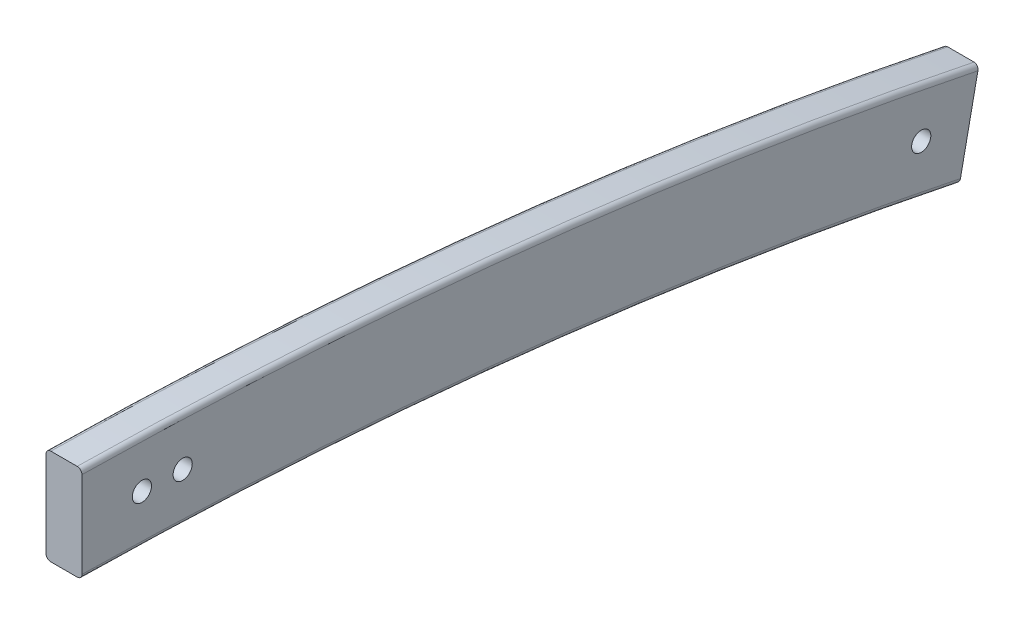
ISO-10303-21;
HEADER;
FILE_DESCRIPTION(('STEP AP214'),'2;1');
FILE_NAME('part.step','',(''),(''),'','','');
FILE_SCHEMA(('AUTOMOTIVE_DESIGN { 1 0 10303 214 1 1 1 1 }'));
ENDSEC;
DATA;
#1=APPLICATION_CONTEXT('core data for automotive mechanical design processes');
#2=APPLICATION_PROTOCOL_DEFINITION('international standard','automotive_design',2000,#1);
#3=PRODUCT_CONTEXT('',#1,'mechanical');
#4=PRODUCT('Part','Part','',(#3));
#5=PRODUCT_RELATED_PRODUCT_CATEGORY('part','',(#4));
#6=PRODUCT_DEFINITION_FORMATION('','',#4);
#7=PRODUCT_DEFINITION_CONTEXT('part definition',#1,'design');
#8=PRODUCT_DEFINITION('design','',#6,#7);
#9=PRODUCT_DEFINITION_SHAPE('','',#8);
#10=(LENGTH_UNIT() NAMED_UNIT(*) SI_UNIT(.MILLI.,.METRE.));
#11=(NAMED_UNIT(*) PLANE_ANGLE_UNIT() SI_UNIT($,.RADIAN.));
#12=(NAMED_UNIT(*) SI_UNIT($,.STERADIAN.) SOLID_ANGLE_UNIT());
#13=UNCERTAINTY_MEASURE_WITH_UNIT(LENGTH_MEASURE(1.E-05),#10,'distance_accuracy_value','');
#14=(GEOMETRIC_REPRESENTATION_CONTEXT(3) GLOBAL_UNCERTAINTY_ASSIGNED_CONTEXT((#13)) GLOBAL_UNIT_ASSIGNED_CONTEXT((#10,
#11,#12)) REPRESENTATION_CONTEXT('',''));
#15=CARTESIAN_POINT('',(0.,0.,0.));
#16=DIRECTION('',(0.,0.,1.));
#17=DIRECTION('',(1.,0.,0.));
#18=AXIS2_PLACEMENT_3D('',#15,#16,#17);
#19=CARTESIAN_POINT('',(7.49999999999988,-36.8067517614209,-380.));
#20=DIRECTION('',(-1.,0.,0.));
#21=DIRECTION('',(0.,0.,1.));
#22=AXIS2_PLACEMENT_3D('',#19,#20,#21);
#23=CYLINDRICAL_SURFACE('',#22,4.);
#24=CARTESIAN_POINT('',(-7.49999999999988,-36.8067517614209,-380.));
#25=DIRECTION('',(-1.,0.,0.));
#26=DIRECTION('',(0.,1.,0.));
#27=AXIS2_PLACEMENT_3D('',#24,#25,#26);
#28=CIRCLE('',#27,4.);
#29=CARTESIAN_POINT('',(-7.49999999999988,-32.8067517614209,-380.));
#30=VERTEX_POINT('',#29);
#31=EDGE_CURVE('E237',#30,#30,#28,.T.);
#32=ORIENTED_EDGE('',*,*,#31,.T.);
#33=EDGE_LOOP('',(#32));
#34=FACE_BOUND('',#33,.T.);
#35=CARTESIAN_POINT('',(7.49999999999988,-36.8067517614209,-380.));
#36=DIRECTION('',(-1.,0.,0.));
#37=DIRECTION('',(0.,1.,0.));
#38=AXIS2_PLACEMENT_3D('',#35,#36,#37);
#39=CIRCLE('',#38,4.);
#40=CARTESIAN_POINT('',(7.49999999999988,-32.8067517614209,-380.));
#41=VERTEX_POINT('',#40);
#42=EDGE_CURVE('E240',#41,#41,#39,.T.);
#43=ORIENTED_EDGE('',*,*,#42,.F.);
#44=EDGE_LOOP('',(#43));
#45=FACE_BOUND('',#44,.T.);
#46=ADVANCED_FACE('F17',(#34,#45),#23,.F.);
#47=CARTESIAN_POINT('',(32.,-1.30952395277337,-72.));
#48=DIRECTION('',(-1.,0.,0.));
#49=DIRECTION('',(0.,0.,1.));
#50=AXIS2_PLACEMENT_3D('',#47,#48,#49);
#51=CYLINDRICAL_SURFACE('',#50,4.);
#52=CARTESIAN_POINT('',(-7.5,-1.30952395277337,-72.));
#53=DIRECTION('',(1.,0.,0.));
#54=DIRECTION('',(0.,1.,0.));
#55=AXIS2_PLACEMENT_3D('',#52,#53,#54);
#56=CIRCLE('',#55,4.);
#57=CARTESIAN_POINT('',(-7.5,2.69047604722663,-72.));
#58=VERTEX_POINT('',#57);
#59=EDGE_CURVE('E261',#58,#58,#56,.T.);
#60=ORIENTED_EDGE('',*,*,#59,.F.);
#61=EDGE_LOOP('',(#60));
#62=FACE_BOUND('',#61,.T.);
#63=CARTESIAN_POINT('',(7.5,-1.30952395277337,-72.));
#64=DIRECTION('',(-1.,0.,0.));
#65=DIRECTION('',(0.,-1.,0.));
#66=AXIS2_PLACEMENT_3D('',#63,#64,#65);
#67=CIRCLE('',#66,4.);
#68=CARTESIAN_POINT('',(7.5,-5.30952395277337,-72.));
#69=VERTEX_POINT('',#68);
#70=EDGE_CURVE('E243',#69,#69,#67,.T.);
#71=ORIENTED_EDGE('',*,*,#70,.F.);
#72=EDGE_LOOP('',(#71));
#73=FACE_BOUND('',#72,.T.);
#74=ADVANCED_FACE('F19',(#62,#73),#51,.F.);
#75=CARTESIAN_POINT('',(32.,-0.764036300876052,-55.));
#76=DIRECTION('',(-1.,0.,0.));
#77=DIRECTION('',(0.,0.,1.));
#78=AXIS2_PLACEMENT_3D('',#75,#76,#77);
#79=CYLINDRICAL_SURFACE('',#78,4.);
#80=CARTESIAN_POINT('',(-7.5,-0.764036300876052,-55.));
#81=DIRECTION('',(1.,0.,0.));
#82=DIRECTION('',(0.,1.,0.));
#83=AXIS2_PLACEMENT_3D('',#80,#81,#82);
#84=CIRCLE('',#83,4.);
#85=CARTESIAN_POINT('',(-7.5,3.23596369912395,-55.));
#86=VERTEX_POINT('',#85);
#87=EDGE_CURVE('E157',#86,#86,#84,.T.);
#88=ORIENTED_EDGE('',*,*,#87,.F.);
#89=EDGE_LOOP('',(#88));
#90=FACE_BOUND('',#89,.T.);
#91=CARTESIAN_POINT('',(7.5,-0.764036300876052,-55.));
#92=DIRECTION('',(-1.,0.,0.));
#93=DIRECTION('',(0.,-1.,0.));
#94=AXIS2_PLACEMENT_3D('',#91,#92,#93);
#95=CIRCLE('',#94,4.);
#96=CARTESIAN_POINT('',(7.5,-4.76403630087605,-55.));
#97=VERTEX_POINT('',#96);
#98=EDGE_CURVE('E184',#97,#97,#95,.T.);
#99=ORIENTED_EDGE('',*,*,#98,.F.);
#100=EDGE_LOOP('',(#99));
#101=FACE_BOUND('',#100,.T.);
#102=ADVANCED_FACE('F202',(#90,#101),#79,.F.);
#103=CARTESIAN_POINT('',(352.504891981738,91.5270283769449,-30.));
#104=DIRECTION('',(0.,0.,-1.));
#105=DIRECTION('',(-1.,0.,0.));
#106=AXIS2_PLACEMENT_3D('',#103,#104,#105);
#107=PLANE('',#106);
#108=CARTESIAN_POINT('',(5.5,-20.2296052853538,-30.));
#109=CARTESIAN_POINT('',(5.55626471267266,-20.2296049146206,-30.));
#110=CARTESIAN_POINT('',(5.612502468504,-20.2272292287357,-30.));
#111=CARTESIAN_POINT('',(5.72457551460424,-20.2177516746596,-30.));
#112=CARTESIAN_POINT('',(5.78041082414159,-20.2106500342789,-30.));
#113=CARTESIAN_POINT('',(5.94661516440308,-20.1823237442016,-30.));
#114=CARTESIAN_POINT('',(6.05587082867905,-20.1540775378476,-30.));
#115=CARTESIAN_POINT('',(6.26808608247271,-20.0796447523956,-30.));
#116=CARTESIAN_POINT('',(6.37104262941814,-20.0334495816251,-30.));
#117=CARTESIAN_POINT('',(6.56773655169667,-19.9244356522238,-30.));
#118=CARTESIAN_POINT('',(6.6614755386857,-19.8616198067702,-30.));
#119=CARTESIAN_POINT('',(6.83707923510438,-19.7211436726315,-30.));
#120=CARTESIAN_POINT('',(6.9189434430339,-19.6434827573247,-30.));
#121=CARTESIAN_POINT('',(7.06849101871839,-19.4755023188601,-30.));
#122=CARTESIAN_POINT('',(7.13617160609002,-19.3851803195587,-30.));
#123=CARTESIAN_POINT('',(7.25542662680334,-19.1944377738907,-30.));
#124=CARTESIAN_POINT('',(7.30699612314505,-19.0940141444705,-30.));
#125=CARTESIAN_POINT('',(7.39251888072657,-18.8859547483633,-30.));
#126=CARTESIAN_POINT('',(7.42648243187554,-18.7783232360041,-30.));
#127=CARTESIAN_POINT('',(7.46739699909414,-18.5965905135081,-30.));
#128=CARTESIAN_POINT('',(7.47961573388843,-18.5236316921494,-30.));
#129=CARTESIAN_POINT('',(7.49591616409648,-18.3769158353276,-30.));
#130=CARTESIAN_POINT('',(7.5000093928415,-18.3031600808612,-30.));
#131=CARTESIAN_POINT('',(7.5,-18.2293712056958,-30.));
#132=B_SPLINE_CURVE_WITH_KNOTS('',3,(#108,#109,#110,#111,#112,#113,#114,#115,#116,#117,#118,
#119,#120,#121,#122,#123,#124,#125,#126,#127,#128,#129,#130,#131),.UNSPECIFIED.,.F.,.F.,(4,2,2,
2,2,2,2,2,2,2,2,4),(0.,0.168690454363192,0.337372777737187,0.674179946208958,1.01114853396383,
1.34805809886406,1.68498188811551,2.02197166212995,2.35906460050016,2.69596029994735,
2.91746362242279,3.13865231796292),.UNSPECIFIED.);
#133=CARTESIAN_POINT('',(5.5,-20.2296052853538,-30.));
#134=VERTEX_POINT('',#133);
#135=CARTESIAN_POINT('',(7.5,-18.2293712056958,-30.));
#136=VERTEX_POINT('',#135);
#137=EDGE_CURVE('E206',#134,#136,#132,.T.);
#138=ORIENTED_EDGE('',*,*,#137,.T.);
#139=DIRECTION('',(0.,-1.,0.));
#140=VECTOR('',#139,1.);
#141=CARTESIAN_POINT('',(7.5,20.,-30.));
#142=LINE('',#141,#140);
#143=CARTESIAN_POINT('',(7.5,17.7747620790487,-30.));
#144=VERTEX_POINT('',#143);
#145=EDGE_CURVE('E176',#144,#136,#142,.T.);
#146=ORIENTED_EDGE('',*,*,#145,.F.);
#147=CARTESIAN_POINT('',(7.5,17.7747620790487,-30.));
#148=CARTESIAN_POINT('',(7.4999996223159,17.8310425309917,-30.));
#149=CARTESIAN_POINT('',(7.49762342886363,17.8872960218253,-30.));
#150=CARTESIAN_POINT('',(7.4881438030027,17.999400497699,-30.));
#151=CARTESIAN_POINT('',(7.48104059628239,18.0552515018269,-30.));
#152=CARTESIAN_POINT('',(7.45270782362488,18.2215034091757,-30.));
#153=CARTESIAN_POINT('',(7.424454918634,18.3307907432955,-30.));
#154=CARTESIAN_POINT('',(7.3500031027022,18.5430679433268,-30.));
#155=CARTESIAN_POINT('',(7.30379555694831,18.646054751541,-30.));
#156=CARTESIAN_POINT('',(7.19475030808231,18.8428054650148,-30.));
#157=CARTESIAN_POINT('',(7.13191555012327,18.9365709995943,-30.));
#158=CARTESIAN_POINT('',(6.99140158315613,19.1122125360929,-30.));
#159=CARTESIAN_POINT('',(6.91372326242807,19.1940892489565,-30.));
#160=CARTESIAN_POINT('',(6.74570344610959,19.3436553210634,-30.));
#161=CARTESIAN_POINT('',(6.65535947893881,19.4113419047896,-30.));
#162=CARTESIAN_POINT('',(6.46459003923269,19.5305864772962,-30.));
#163=CARTESIAN_POINT('',(6.36416366624663,19.5821430238217,-30.));
#164=CARTESIAN_POINT('',(6.15609987529275,19.6676355541215,-30.));
#165=CARTESIAN_POINT('',(6.04846673491681,19.7015818876113,-30.));
#166=CARTESIAN_POINT('',(5.86681142043803,19.7424459577892,-30.));
#167=CARTESIAN_POINT('',(5.79393279581419,19.7546416025092,-30.));
#168=CARTESIAN_POINT('',(5.64737964130854,19.770911213388,-30.));
#169=CARTESIAN_POINT('',(5.57370638917758,19.7749966926812,-30.));
#170=CARTESIAN_POINT('',(5.50000000000005,19.7749873423263,-30.));
#171=B_SPLINE_CURVE_WITH_KNOTS('',3,(#147,#148,#149,#150,#151,#152,#153,#154,#155,#156,#157,
#158,#159,#160,#161,#162,#163,#164,#165,#166,#167,#168,#169,#170),.UNSPECIFIED.,.F.,.F.,(4,2,2,
2,2,2,2,2,2,2,2,4),(0.,0.16873765438456,0.337467253071286,0.674371003116423,1.01143697911068,
1.34844329103383,1.685429441875,2.02248144412704,2.35956357501704,2.69644737395836,
2.91770319861281,3.13864470477958),.UNSPECIFIED.);
#172=CARTESIAN_POINT('',(5.5,19.7749873423261,-30.));
#173=VERTEX_POINT('',#172);
#174=EDGE_CURVE('E21',#144,#173,#171,.T.);
#175=ORIENTED_EDGE('',*,*,#174,.T.);
#176=DIRECTION('',(1.,0.,0.));
#177=VECTOR('',#176,1.);
#178=CARTESIAN_POINT('',(0.,19.7749873423259,-30.));
#179=LINE('',#178,#177);
#180=CARTESIAN_POINT('',(-5.5,19.774987342326,-30.));
#181=VERTEX_POINT('',#180);
#182=EDGE_CURVE('E135',#181,#173,#179,.T.);
#183=ORIENTED_EDGE('',*,*,#182,.F.);
#184=CARTESIAN_POINT('',(-5.5,19.7749873423261,-30.));
#185=CARTESIAN_POINT('',(-5.55626489961903,19.7749869714462,-30.));
#186=CARTESIAN_POINT('',(-5.61250284237586,19.7726112809549,-30.));
#187=CARTESIAN_POINT('',(-5.72457626250633,19.7631337075156,-30.));
#188=CARTESIAN_POINT('',(-5.78041175914456,19.756032052333,-30.));
#189=CARTESIAN_POINT('',(-5.94661667398618,19.7277056983064,-30.));
#190=CARTESIAN_POINT('',(-6.0558727243212,19.6994594232861,-30.));
#191=CARTESIAN_POINT('',(-6.26808873699816,19.6250264279608,-30.));
#192=CARTESIAN_POINT('',(-6.37104565645769,19.5788311150986,-30.));
#193=CARTESIAN_POINT('',(-6.56774026907949,19.4698168063707,-30.));
#194=CARTESIAN_POINT('',(-6.66147957426522,19.4070007243473,-30.));
#195=CARTESIAN_POINT('',(-6.83708362052739,19.2665241543427,-30.));
#196=CARTESIAN_POINT('',(-6.91894788525283,19.1888630711639,-30.));
#197=CARTESIAN_POINT('',(-7.06849547692285,19.0208822356259,-30.));
#198=CARTESIAN_POINT('',(-7.13617602360824,18.9305600072384,-30.));
#199=CARTESIAN_POINT('',(-7.25543055338324,18.7398173694325,-30.));
#200=CARTESIAN_POINT('',(-7.30699966937934,18.6393939206297,-30.));
#201=CARTESIAN_POINT('',(-7.39252162701628,18.4313349260463,-30.));
#202=CARTESIAN_POINT('',(-7.42648475960995,18.3237036349959,-30.));
#203=CARTESIAN_POINT('',(-7.46739825803212,18.1419728038948,-30.));
#204=CARTESIAN_POINT('',(-7.47961652142829,18.0690156710561,-30.));
#205=CARTESIAN_POINT('',(-7.49591632193054,17.9223032381268,-30.));
#206=CARTESIAN_POINT('',(-7.50000939200646,17.8485492189731,-30.));
#207=CARTESIAN_POINT('',(-7.5,17.7747620790487,-30.));
#208=B_SPLINE_CURVE_WITH_KNOTS('',3,(#184,#185,#186,#187,#188,#189,#190,#191,#192,#193,#194,
#195,#196,#197,#198,#199,#200,#201,#202,#203,#204,#205,#206,#207),.UNSPECIFIED.,.F.,.F.,(4,2,2,
2,2,2,2,2,2,2,2,4),(0.,0.168691015092788,0.33737390080008,0.67418223745412,1.01115200993267,
1.34806274621393,1.68498699347361,2.02197722218984,2.35906915389024,2.69596382766027,
2.91746194513932,3.1386454408255),.UNSPECIFIED.);
#209=CARTESIAN_POINT('',(-7.5,17.7747620790487,-30.));
#210=VERTEX_POINT('',#209);
#211=EDGE_CURVE('E11',#181,#210,#208,.T.);
#212=ORIENTED_EDGE('',*,*,#211,.T.);
#213=DIRECTION('',(0.,1.,0.));
#214=VECTOR('',#213,1.);
#215=CARTESIAN_POINT('',(-7.5,-20.,-30.));
#216=LINE('',#215,#214);
#217=CARTESIAN_POINT('',(-7.5,-18.2293712056958,-30.));
#218=VERTEX_POINT('',#217);
#219=EDGE_CURVE('E149',#218,#210,#216,.T.);
#220=ORIENTED_EDGE('',*,*,#219,.F.);
#221=CARTESIAN_POINT('',(-7.5,-18.2293712056958,-30.));
#222=CARTESIAN_POINT('',(-7.49999962218892,-18.2856520804089,-30.));
#223=CARTESIAN_POINT('',(-7.49762341301986,-18.3419059938255,-30.));
#224=CARTESIAN_POINT('',(-7.4881437241743,-18.4540113128832,-30.));
#225=CARTESIAN_POINT('',(-7.48104047015733,-18.5098627376097,-30.));
#226=CARTESIAN_POINT('',(-7.45270750582439,-18.6761159113427,-30.));
#227=CARTESIAN_POINT('',(-7.42445440668545,-18.7854040845237,-30.));
#228=CARTESIAN_POINT('',(-7.35000205921416,-18.997682921188,-30.));
#229=CARTESIAN_POINT('',(-7.30379417543092,-19.1006705267504,-30.));
#230=CARTESIAN_POINT('',(-7.19474809404756,-19.2974227470405,-30.));
#231=CARTESIAN_POINT('',(-7.13191284211896,-19.3911889913744,-30.));
#232=CARTESIAN_POINT('',(-6.99139784130386,-19.5668316581229,-30.));
#233=CARTESIAN_POINT('',(-6.91371900578718,-19.6487088115632,-30.));
#234=CARTESIAN_POINT('',(-6.74569804172922,-19.798275607408,-30.));
#235=CARTESIAN_POINT('',(-6.65535344170271,-19.8659624743974,-30.));
#236=CARTESIAN_POINT('',(-6.46458303319247,-19.9852071467113,-30.));
#237=CARTESIAN_POINT('',(-6.36415636569158,-20.0367635761392,-30.));
#238=CARTESIAN_POINT('',(-6.15609198674887,-20.1222557421443,-30.));
#239=CARTESIAN_POINT('',(-6.04845855337553,-20.1562018296567,-30.));
#240=CARTESIAN_POINT('',(-5.8668043153373,-20.1970650202595,-30.));
#241=CARTESIAN_POINT('',(-5.7939270862844,-20.2092602454147,-30.));
#242=CARTESIAN_POINT('',(-5.64737676552387,-20.2255292963828,-30.));
#243=CARTESIAN_POINT('',(-5.57370495150468,-20.2296146349421,-30.));
#244=CARTESIAN_POINT('',(-5.50000000000002,-20.2296052853539,-30.));
#245=B_SPLINE_CURVE_WITH_KNOTS('',3,(#221,#222,#223,#224,#225,#226,#227,#228,#229,#230,#231,
#232,#233,#234,#235,#236,#237,#238,#239,#240,#241,#242,#243,#244),.UNSPECIFIED.,.F.,.F.,(4,2,2,
2,2,2,2,2,2,2,2,4),(0.,0.168738922028639,0.337469789381249,0.674376110253315,1.01144466901046,
1.34845355330274,1.68544170711044,2.02249570956764,2.35957845427434,2.69646284472868,
2.91771435514461,3.13865155299384),.UNSPECIFIED.);
#246=CARTESIAN_POINT('',(-5.5,-20.2296052853539,-30.));
#247=VERTEX_POINT('',#246);
#248=EDGE_CURVE('E34',#218,#247,#245,.T.);
#249=ORIENTED_EDGE('',*,*,#248,.T.);
#250=DIRECTION('',(-1.,0.,0.));
#251=VECTOR('',#250,1.);
#252=CARTESIAN_POINT('',(0.,-20.2296052853539,-30.));
#253=LINE('',#252,#251);
#254=EDGE_CURVE('E163',#134,#247,#253,.T.);
#255=ORIENTED_EDGE('',*,*,#254,.F.);
#256=EDGE_LOOP('',(#138,#146,#175,#183,#212,#220,#249,#255));
#257=FACE_BOUND('',#256,.T.);
#258=ADVANCED_FACE('F199',(#257),#107,.F.);
#259=CARTESIAN_POINT('',(-5.50000000000012,-1980.,-1.17562209966948E-13));
#260=DIRECTION('',(1.,0.,0.));
#261=DIRECTION('',(0.,1.,0.));
#262=AXIS2_PLACEMENT_3D('',#259,#260,#261);
#263=TOROIDAL_SURFACE('',#262,1998.,2.);
#264=ORIENTED_EDGE('',*,*,#211,.F.);
#265=CARTESIAN_POINT('',(-5.50000000000012,-1980.,-1.17562209966948E-13));
#266=DIRECTION('',(1.,0.,0.));
#267=DIRECTION('',(0.,1.,0.));
#268=AXIS2_PLACEMENT_3D('',#265,#266,#267);
#269=CIRCLE('',#268,2000.);
#270=CARTESIAN_POINT('',(-5.5,-21.2372905574123,-404.040404040404));
#271=VERTEX_POINT('',#270);
#272=EDGE_CURVE('E128',#271,#181,#269,.T.);
#273=ORIENTED_EDGE('',*,*,#272,.F.);
#274=CARTESIAN_POINT('',(-5.5,-23.1960532668549,-403.636363636363));
#275=DIRECTION('',(0.,-0.202020202020202,-0.979381354721294));
#276=DIRECTION('',(0.,0.979381354721294,-0.202020202020202));
#277=AXIS2_PLACEMENT_3D('',#274,#275,#276);
#278=CIRCLE('',#277,2.);
#279=CARTESIAN_POINT('',(-7.5,-23.1960532668549,-403.636363636363));
#280=VERTEX_POINT('',#279);
#281=EDGE_CURVE('E112',#280,#271,#278,.T.);
#282=ORIENTED_EDGE('',*,*,#281,.F.);
#283=CARTESIAN_POINT('',(-7.50000000000012,-1980.,-1.17562209966948E-13));
#284=DIRECTION('',(-1.,0.,0.));
#285=DIRECTION('',(0.,1.,0.));
#286=AXIS2_PLACEMENT_3D('',#283,#284,#285);
#287=CIRCLE('',#286,1998.);
#288=EDGE_CURVE('E143',#210,#280,#287,.T.);
#289=ORIENTED_EDGE('',*,*,#288,.F.);
#290=EDGE_LOOP('',(#264,#273,#282,#289));
#291=FACE_BOUND('',#290,.T.);
#292=ADVANCED_FACE('F132',(#291),#263,.T.);
#293=CARTESIAN_POINT('',(-5.50000000000012,-1980.,-1.17562209966948E-13));
#294=DIRECTION('',(1.,0.,0.));
#295=DIRECTION('',(0.,1.,0.));
#296=AXIS2_PLACEMENT_3D('',#293,#294,#295);
#297=TOROIDAL_SURFACE('',#296,1962.,2.);
#298=ORIENTED_EDGE('',*,*,#248,.F.);
#299=CARTESIAN_POINT('',(-7.50000000000012,-1980.,-1.17562209966948E-13));
#300=DIRECTION('',(1.,0.,0.));
#301=DIRECTION('',(0.,1.,0.));
#302=AXIS2_PLACEMENT_3D('',#299,#300,#301);
#303=CIRCLE('',#302,1962.);
#304=CARTESIAN_POINT('',(-7.5,-58.4537820368214,-396.363636363636));
#305=VERTEX_POINT('',#304);
#306=EDGE_CURVE('E153',#305,#218,#303,.T.);
#307=ORIENTED_EDGE('',*,*,#306,.F.);
#308=CARTESIAN_POINT('',(-5.5,-58.4537820368216,-396.363636363636));
#309=DIRECTION('',(0.,-0.202020202020202,-0.979381354721294));
#310=DIRECTION('',(0.,0.979381354721294,-0.202020202020202));
#311=AXIS2_PLACEMENT_3D('',#308,#309,#310);
#312=CIRCLE('',#311,2.);
#313=CARTESIAN_POINT('',(-5.5,-60.412544746264,-395.959595959596));
#314=VERTEX_POINT('',#313);
#315=EDGE_CURVE('E273',#314,#305,#312,.T.);
#316=ORIENTED_EDGE('',*,*,#315,.F.);
#317=CARTESIAN_POINT('',(-5.50000000000012,-1980.,-1.17562209966948E-13));
#318=DIRECTION('',(-1.,0.,0.));
#319=DIRECTION('',(0.,1.,0.));
#320=AXIS2_PLACEMENT_3D('',#317,#318,#319);
#321=CIRCLE('',#320,1960.);
#322=EDGE_CURVE('E158',#247,#314,#321,.T.);
#323=ORIENTED_EDGE('',*,*,#322,.F.);
#324=EDGE_LOOP('',(#298,#307,#316,#323));
#325=FACE_BOUND('',#324,.T.);
#326=ADVANCED_FACE('F219',(#325),#297,.T.);
#327=CARTESIAN_POINT('',(5.49999999999988,-1980.,-1.17562209966948E-13));
#328=DIRECTION('',(-1.,0.,0.));
#329=DIRECTION('',(0.,-1.,0.));
#330=AXIS2_PLACEMENT_3D('',#327,#328,#329);
#331=TOROIDAL_SURFACE('',#330,1962.,2.);
#332=ORIENTED_EDGE('',*,*,#137,.F.);
#333=CARTESIAN_POINT('',(5.49999999999988,-1980.,-1.17562209966948E-13));
#334=DIRECTION('',(1.,0.,0.));
#335=DIRECTION('',(0.,-1.,0.));
#336=AXIS2_PLACEMENT_3D('',#333,#334,#335);
#337=CIRCLE('',#336,1960.);
#338=CARTESIAN_POINT('',(5.5,-60.412544746264,-395.959595959596));
#339=VERTEX_POINT('',#338);
#340=EDGE_CURVE('E167',#339,#134,#337,.T.);
#341=ORIENTED_EDGE('',*,*,#340,.F.);
#342=CARTESIAN_POINT('',(5.5,-58.4537820368216,-396.363636363636));
#343=DIRECTION('',(0.,-0.202020202020202,-0.979381354721294));
#344=DIRECTION('',(0.,0.979381354721294,-0.202020202020202));
#345=AXIS2_PLACEMENT_3D('',#342,#343,#344);
#346=CIRCLE('',#345,2.);
#347=CARTESIAN_POINT('',(7.5,-58.4537820368214,-396.363636363636));
#348=VERTEX_POINT('',#347);
#349=EDGE_CURVE('E270',#348,#339,#346,.T.);
#350=ORIENTED_EDGE('',*,*,#349,.F.);
#351=CARTESIAN_POINT('',(7.49999999999988,-1980.,-1.17562209966948E-13));
#352=DIRECTION('',(-1.,0.,0.));
#353=DIRECTION('',(0.,-1.,0.));
#354=AXIS2_PLACEMENT_3D('',#351,#352,#353);
#355=CIRCLE('',#354,1962.);
#356=EDGE_CURVE('E172',#136,#348,#355,.T.);
#357=ORIENTED_EDGE('',*,*,#356,.F.);
#358=EDGE_LOOP('',(#332,#341,#350,#357));
#359=FACE_BOUND('',#358,.T.);
#360=ADVANCED_FACE('F214',(#359),#331,.T.);
#361=CARTESIAN_POINT('',(5.49999999999988,-1980.,-1.17562209966948E-13));
#362=DIRECTION('',(-1.,0.,0.));
#363=DIRECTION('',(0.,-1.,0.));
#364=AXIS2_PLACEMENT_3D('',#361,#362,#363);
#365=TOROIDAL_SURFACE('',#364,1998.,2.);
#366=ORIENTED_EDGE('',*,*,#174,.F.);
#367=CARTESIAN_POINT('',(7.49999999999988,-1980.,-1.17562209966948E-13));
#368=DIRECTION('',(1.,0.,0.));
#369=DIRECTION('',(0.,-1.,0.));
#370=AXIS2_PLACEMENT_3D('',#367,#368,#369);
#371=CIRCLE('',#370,1998.);
#372=CARTESIAN_POINT('',(7.5,-23.1960532668549,-403.636363636363));
#373=VERTEX_POINT('',#372);
#374=EDGE_CURVE('E180',#373,#144,#371,.T.);
#375=ORIENTED_EDGE('',*,*,#374,.F.);
#376=CARTESIAN_POINT('',(5.5,-23.1960532668549,-403.636363636363));
#377=DIRECTION('',(0.,-0.202020202020202,-0.979381354721294));
#378=DIRECTION('',(0.,0.979381354721294,-0.202020202020202));
#379=AXIS2_PLACEMENT_3D('',#376,#377,#378);
#380=CIRCLE('',#379,2.);
#381=CARTESIAN_POINT('',(5.5,-21.2372905574123,-404.040404040404));
#382=VERTEX_POINT('',#381);
#383=EDGE_CURVE('E47',#382,#373,#380,.T.);
#384=ORIENTED_EDGE('',*,*,#383,.F.);
#385=CARTESIAN_POINT('',(5.49999999999988,-1980.,-1.17562209966948E-13));
#386=DIRECTION('',(-1.,0.,0.));
#387=DIRECTION('',(0.,-1.,0.));
#388=AXIS2_PLACEMENT_3D('',#385,#386,#387);
#389=CIRCLE('',#388,2000.);
#390=EDGE_CURVE('E129',#173,#382,#389,.T.);
#391=ORIENTED_EDGE('',*,*,#390,.F.);
#392=EDGE_LOOP('',(#366,#375,#384,#391));
#393=FACE_BOUND('',#392,.T.);
#394=ADVANCED_FACE('F218',(#393),#365,.T.);
#395=CARTESIAN_POINT('',(3.75,-50.6187311990511,-397.979797979798));
#396=DIRECTION('',(0.,-0.202020202020202,-0.979381354721294));
#397=DIRECTION('',(0.,-0.979381354721294,0.202020202020202));
#398=AXIS2_PLACEMENT_3D('',#395,#396,#397);
#399=PLANE('',#398);
#400=DIRECTION('',(0.,-0.979381354721294,0.202020202020202));
#401=VECTOR('',#400,1.);
#402=CARTESIAN_POINT('',(-7.5,-60.412544746264,-395.959595959596));
#403=LINE('',#402,#401);
#404=EDGE_CURVE('E120',#280,#305,#403,.T.);
#405=ORIENTED_EDGE('',*,*,#404,.F.);
#406=ORIENTED_EDGE('',*,*,#281,.T.);
#407=DIRECTION('',(-1.,0.,0.));
#408=VECTOR('',#407,1.);
#409=CARTESIAN_POINT('',(-7.5,-21.2372905574123,-404.040404040404));
#410=LINE('',#409,#408);
#411=EDGE_CURVE('E117',#382,#271,#410,.T.);
#412=ORIENTED_EDGE('',*,*,#411,.F.);
#413=ORIENTED_EDGE('',*,*,#383,.T.);
#414=DIRECTION('',(0.,0.979381354721294,-0.202020202020202));
#415=VECTOR('',#414,1.);
#416=CARTESIAN_POINT('',(7.5,-21.2372905574123,-404.040404040404));
#417=LINE('',#416,#415);
#418=EDGE_CURVE('E171',#348,#373,#417,.T.);
#419=ORIENTED_EDGE('',*,*,#418,.F.);
#420=ORIENTED_EDGE('',*,*,#349,.T.);
#421=DIRECTION('',(1.,0.,0.));
#422=VECTOR('',#421,1.);
#423=CARTESIAN_POINT('',(7.5,-60.412544746264,-395.959595959596));
#424=LINE('',#423,#422);
#425=EDGE_CURVE('E162',#314,#339,#424,.T.);
#426=ORIENTED_EDGE('',*,*,#425,.F.);
#427=ORIENTED_EDGE('',*,*,#315,.T.);
#428=EDGE_LOOP('',(#405,#406,#412,#413,#419,#420,#426,#427));
#429=FACE_BOUND('',#428,.T.);
#430=ADVANCED_FACE('F116',(#429),#399,.T.);
#431=CARTESIAN_POINT('',(-1.21236029028415E-13,-1980.,-1.17562209966948E-13));
#432=DIRECTION('',(-1.,0.,0.));
#433=DIRECTION('',(0.,-1.,0.));
#434=AXIS2_PLACEMENT_3D('',#431,#432,#433);
#435=CYLINDRICAL_SURFACE('',#434,2000.);
#436=ORIENTED_EDGE('',*,*,#272,.T.);
#437=ORIENTED_EDGE('',*,*,#182,.T.);
#438=ORIENTED_EDGE('',*,*,#390,.T.);
#439=ORIENTED_EDGE('',*,*,#411,.T.);
#440=EDGE_LOOP('',(#436,#437,#438,#439));
#441=FACE_BOUND('',#440,.T.);
#442=ADVANCED_FACE('F126',(#441),#435,.T.);
#443=CARTESIAN_POINT('',(-7.5,-20.,0.));
#444=DIRECTION('',(1.,0.,0.));
#445=DIRECTION('',(0.,-1.,0.));
#446=AXIS2_PLACEMENT_3D('',#443,#444,#445);
#447=PLANE('',#446);
#448=ORIENTED_EDGE('',*,*,#306,.T.);
#449=ORIENTED_EDGE('',*,*,#219,.T.);
#450=ORIENTED_EDGE('',*,*,#288,.T.);
#451=ORIENTED_EDGE('',*,*,#404,.T.);
#452=EDGE_LOOP('',(#448,#449,#450,#451));
#453=FACE_BOUND('',#452,.T.);
#454=ORIENTED_EDGE('',*,*,#87,.T.);
#455=EDGE_LOOP('',(#454));
#456=FACE_BOUND('',#455,.T.);
#457=ORIENTED_EDGE('',*,*,#59,.T.);
#458=EDGE_LOOP('',(#457));
#459=FACE_BOUND('',#458,.T.);
#460=ORIENTED_EDGE('',*,*,#31,.F.);
#461=EDGE_LOOP('',(#460));
#462=FACE_BOUND('',#461,.T.);
#463=ADVANCED_FACE('F294',(#453,#456,#459,#462),#447,.F.);
#464=CARTESIAN_POINT('',(-1.21236029028415E-13,-1980.,-1.17562209966948E-13));
#465=DIRECTION('',(-1.,0.,0.));
#466=DIRECTION('',(0.,-1.,0.));
#467=AXIS2_PLACEMENT_3D('',#464,#465,#466);
#468=CYLINDRICAL_SURFACE('',#467,1960.);
#469=ORIENTED_EDGE('',*,*,#340,.T.);
#470=ORIENTED_EDGE('',*,*,#254,.T.);
#471=ORIENTED_EDGE('',*,*,#322,.T.);
#472=ORIENTED_EDGE('',*,*,#425,.T.);
#473=EDGE_LOOP('',(#469,#470,#471,#472));
#474=FACE_BOUND('',#473,.T.);
#475=ADVANCED_FACE('F288',(#474),#468,.F.);
#476=CARTESIAN_POINT('',(7.5,20.,0.));
#477=DIRECTION('',(-1.,0.,0.));
#478=DIRECTION('',(0.,0.,1.));
#479=AXIS2_PLACEMENT_3D('',#476,#477,#478);
#480=PLANE('',#479);
#481=ORIENTED_EDGE('',*,*,#374,.T.);
#482=ORIENTED_EDGE('',*,*,#145,.T.);
#483=ORIENTED_EDGE('',*,*,#356,.T.);
#484=ORIENTED_EDGE('',*,*,#418,.T.);
#485=EDGE_LOOP('',(#481,#482,#483,#484));
#486=FACE_BOUND('',#485,.T.);
#487=ORIENTED_EDGE('',*,*,#98,.T.);
#488=EDGE_LOOP('',(#487));
#489=FACE_BOUND('',#488,.T.);
#490=ORIENTED_EDGE('',*,*,#70,.T.);
#491=EDGE_LOOP('',(#490));
#492=FACE_BOUND('',#491,.T.);
#493=ORIENTED_EDGE('',*,*,#42,.T.);
#494=EDGE_LOOP('',(#493));
#495=FACE_BOUND('',#494,.T.);
#496=ADVANCED_FACE('F284',(#486,#489,#492,#495),#480,.F.);
#497=CLOSED_SHELL('',(#46,#74,#102,#258,#292,#326,#360,#394,#430,#442,#463,#475,#496));
#498=MANIFOLD_SOLID_BREP('B1',#497);
#499=ADVANCED_BREP_SHAPE_REPRESENTATION('',(#18,#498),#14);
#500=SHAPE_DEFINITION_REPRESENTATION(#9,#499);
ENDSEC;
END-ISO-10303-21;
